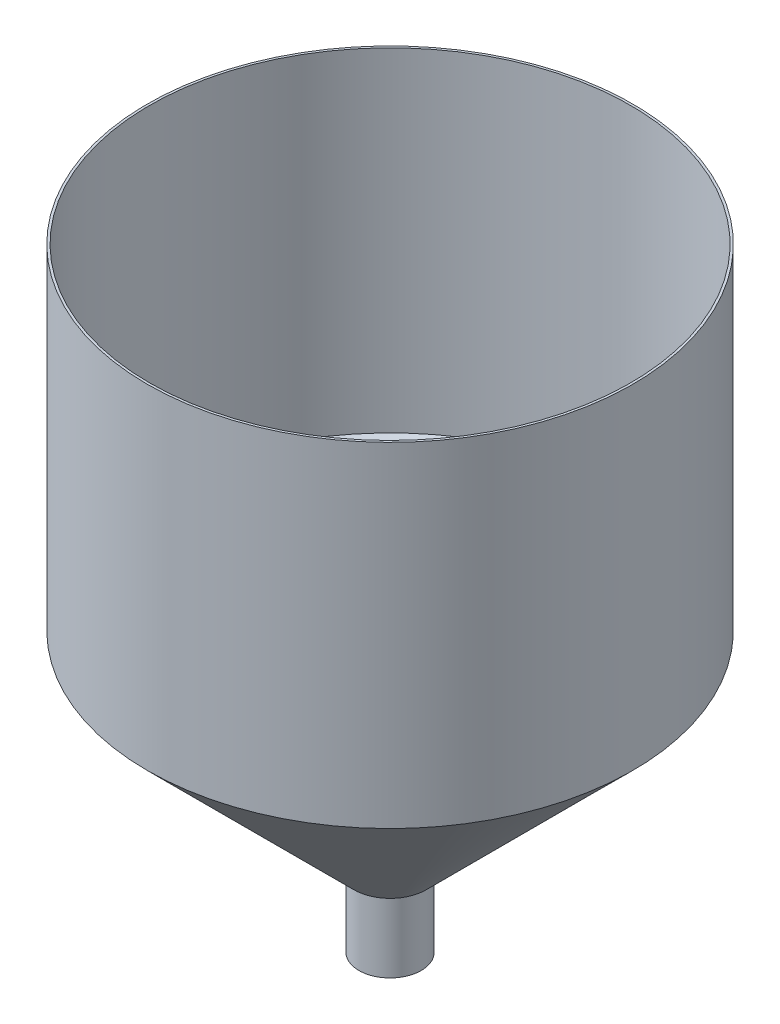
ISO-10303-21;
HEADER;
FILE_DESCRIPTION(('STEP AP214'),'2;1');
FILE_NAME('part.step','',(''),(''),'','','');
FILE_SCHEMA(('AUTOMOTIVE_DESIGN { 1 0 10303 214 1 1 1 1 }'));
ENDSEC;
DATA;
#1=APPLICATION_CONTEXT('core data for automotive mechanical design processes');
#2=APPLICATION_PROTOCOL_DEFINITION('international standard','automotive_design',2000,#1);
#3=PRODUCT_CONTEXT('',#1,'mechanical');
#4=PRODUCT('Part','Part','',(#3));
#5=PRODUCT_RELATED_PRODUCT_CATEGORY('part','',(#4));
#6=PRODUCT_DEFINITION_FORMATION('','',#4);
#7=PRODUCT_DEFINITION_CONTEXT('part definition',#1,'design');
#8=PRODUCT_DEFINITION('design','',#6,#7);
#9=PRODUCT_DEFINITION_SHAPE('','',#8);
#10=(LENGTH_UNIT() NAMED_UNIT(*) SI_UNIT(.MILLI.,.METRE.));
#11=(NAMED_UNIT(*) PLANE_ANGLE_UNIT() SI_UNIT($,.RADIAN.));
#12=(NAMED_UNIT(*) SI_UNIT($,.STERADIAN.) SOLID_ANGLE_UNIT());
#13=UNCERTAINTY_MEASURE_WITH_UNIT(LENGTH_MEASURE(1.E-05),#10,'distance_accuracy_value','');
#14=(GEOMETRIC_REPRESENTATION_CONTEXT(3) GLOBAL_UNCERTAINTY_ASSIGNED_CONTEXT((#13)) GLOBAL_UNIT_ASSIGNED_CONTEXT((#10,
#11,#12)) REPRESENTATION_CONTEXT('',''));
#15=CARTESIAN_POINT('',(0.,0.,0.));
#16=DIRECTION('',(0.,0.,1.));
#17=DIRECTION('',(1.,0.,0.));
#18=AXIS2_PLACEMENT_3D('',#15,#16,#17);
#19=CARTESIAN_POINT('',(0.,-461.3,0.));
#20=DIRECTION('',(0.,1.,0.));
#21=DIRECTION('',(0.,0.,1.));
#22=AXIS2_PLACEMENT_3D('',#19,#20,#21);
#23=CYLINDRICAL_SURFACE('',#22,334.8);
#24=CARTESIAN_POINT('',(0.,-461.3,0.));
#25=DIRECTION('',(0.,-1.,0.));
#26=DIRECTION('',(0.,0.,-1.));
#27=AXIS2_PLACEMENT_3D('',#24,#25,#26);
#28=CIRCLE('',#27,334.8);
#29=CARTESIAN_POINT('',(0.,-461.3,334.8));
#30=VERTEX_POINT('',#29);
#31=EDGE_CURVE('E45',#30,#30,#28,.T.);
#32=ORIENTED_EDGE('',*,*,#31,.F.);
#33=EDGE_LOOP('',(#32));
#34=FACE_BOUND('',#33,.T.);
#35=CARTESIAN_POINT('',(0.,0.,0.));
#36=DIRECTION('',(0.,1.,0.));
#37=DIRECTION('',(0.,0.,1.));
#38=AXIS2_PLACEMENT_3D('',#35,#36,#37);
#39=CIRCLE('',#38,334.8);
#40=CARTESIAN_POINT('',(0.,0.,334.8));
#41=VERTEX_POINT('',#40);
#42=EDGE_CURVE('E37',#41,#41,#39,.T.);
#43=ORIENTED_EDGE('',*,*,#42,.F.);
#44=EDGE_LOOP('',(#43));
#45=FACE_BOUND('',#44,.T.);
#46=ADVANCED_FACE('F34',(#34,#45),#23,.T.);
#47=CARTESIAN_POINT('',(0.,0.,0.));
#48=DIRECTION('',(0.,1.,0.));
#49=DIRECTION('',(0.,0.,1.));
#50=AXIS2_PLACEMENT_3D('',#47,#48,#49);
#51=PLANE('',#50);
#52=CARTESIAN_POINT('',(0.,0.,0.));
#53=DIRECTION('',(0.,1.,0.));
#54=DIRECTION('',(0.,0.,1.));
#55=AXIS2_PLACEMENT_3D('',#52,#53,#54);
#56=CIRCLE('',#55,331.625);
#57=CARTESIAN_POINT('',(0.,0.,331.625));
#58=VERTEX_POINT('',#57);
#59=EDGE_CURVE('E85',#58,#58,#56,.T.);
#60=ORIENTED_EDGE('',*,*,#59,.F.);
#61=EDGE_LOOP('',(#60));
#62=FACE_BOUND('',#61,.T.);
#63=ORIENTED_EDGE('',*,*,#42,.T.);
#64=EDGE_LOOP('',(#63));
#65=FACE_BOUND('',#64,.T.);
#66=ADVANCED_FACE('F73',(#62,#65),#51,.T.);
#67=CARTESIAN_POINT('',(0.,-746.1,0.));
#68=DIRECTION('',(0.,1.,0.));
#69=DIRECTION('',(0.,0.,1.));
#70=AXIS2_PLACEMENT_3D('',#67,#68,#69);
#71=PLANE('',#70);
#72=CARTESIAN_POINT('',(0.,-746.1,0.));
#73=DIRECTION('',(0.,-1.,0.));
#74=DIRECTION('',(0.,0.,-1.));
#75=AXIS2_PLACEMENT_3D('',#72,#73,#74);
#76=CIRCLE('',#75,43.);
#77=CARTESIAN_POINT('',(0.,-746.1,-43.));
#78=VERTEX_POINT('',#77);
#79=EDGE_CURVE('E11',#78,#78,#76,.T.);
#80=ORIENTED_EDGE('',*,*,#79,.F.);
#81=EDGE_LOOP('',(#80));
#82=FACE_BOUND('',#81,.T.);
#83=CARTESIAN_POINT('',(0.,-746.1,0.));
#84=DIRECTION('',(0.,1.,0.));
#85=DIRECTION('',(0.,0.,1.));
#86=AXIS2_PLACEMENT_3D('',#83,#84,#85);
#87=CIRCLE('',#86,50.);
#88=CARTESIAN_POINT('',(0.,-746.1,50.));
#89=VERTEX_POINT('',#88);
#90=EDGE_CURVE('E54',#89,#89,#87,.T.);
#91=ORIENTED_EDGE('',*,*,#90,.F.);
#92=EDGE_LOOP('',(#91));
#93=FACE_BOUND('',#92,.T.);
#94=ADVANCED_FACE('F70',(#82,#93),#71,.F.);
#95=CARTESIAN_POINT('',(0.,-746.1,0.));
#96=DIRECTION('',(0.,1.,0.));
#97=DIRECTION('',(0.,0.,1.));
#98=AXIS2_PLACEMENT_3D('',#95,#96,#97);
#99=CONICAL_SURFACE('',#98,50.,0.785398163397448);
#100=CARTESIAN_POINT('',(0.,-746.1,50.));
#101=CARTESIAN_POINT('',(0.,-743.133333333333,52.9666666666666));
#102=CARTESIAN_POINT('',(0.,-740.166666666667,55.9333333333333));
#103=CARTESIAN_POINT('',(0.,-734.233333333333,61.8666666666666));
#104=CARTESIAN_POINT('',(0.,-731.266666666667,64.8333333333333));
#105=CARTESIAN_POINT('',(0.,-725.333333333333,70.7666666666666));
#106=CARTESIAN_POINT('',(0.,-722.366666666667,73.7333333333333));
#107=CARTESIAN_POINT('',(0.,-716.433333333333,79.6666666666666));
#108=CARTESIAN_POINT('',(0.,-713.466666666667,82.6333333333333));
#109=CARTESIAN_POINT('',(0.,-707.533333333333,88.5666666666666));
#110=CARTESIAN_POINT('',(0.,-704.566666666667,91.5333333333333));
#111=CARTESIAN_POINT('',(0.,-698.633333333333,97.4666666666666));
#112=CARTESIAN_POINT('',(0.,-695.666666666667,100.433333333333));
#113=CARTESIAN_POINT('',(0.,-689.733333333333,106.366666666667));
#114=CARTESIAN_POINT('',(0.,-686.766666666667,109.333333333333));
#115=CARTESIAN_POINT('',(0.,-680.833333333333,115.266666666667));
#116=CARTESIAN_POINT('',(0.,-677.866666666667,118.233333333333));
#117=CARTESIAN_POINT('',(0.,-671.933333333333,124.166666666667));
#118=CARTESIAN_POINT('',(0.,-668.966666666667,127.133333333333));
#119=CARTESIAN_POINT('',(0.,-663.033333333333,133.066666666667));
#120=CARTESIAN_POINT('',(0.,-660.066666666667,136.033333333333));
#121=CARTESIAN_POINT('',(0.,-654.133333333333,141.966666666667));
#122=CARTESIAN_POINT('',(0.,-651.166666666667,144.933333333333));
#123=CARTESIAN_POINT('',(0.,-645.233333333333,150.866666666667));
#124=CARTESIAN_POINT('',(0.,-642.266666666667,153.833333333333));
#125=CARTESIAN_POINT('',(0.,-636.333333333333,159.766666666667));
#126=CARTESIAN_POINT('',(0.,-633.366666666667,162.733333333333));
#127=CARTESIAN_POINT('',(0.,-627.433333333333,168.666666666667));
#128=CARTESIAN_POINT('',(0.,-624.466666666667,171.633333333333));
#129=CARTESIAN_POINT('',(0.,-618.533333333333,177.566666666667));
#130=CARTESIAN_POINT('',(0.,-615.566666666667,180.533333333333));
#131=CARTESIAN_POINT('',(0.,-609.633333333333,186.466666666667));
#132=CARTESIAN_POINT('',(0.,-606.666666666667,189.433333333333));
#133=CARTESIAN_POINT('',(0.,-600.733333333333,195.366666666667));
#134=CARTESIAN_POINT('',(0.,-597.766666666667,198.333333333333));
#135=CARTESIAN_POINT('',(0.,-591.833333333333,204.266666666667));
#136=CARTESIAN_POINT('',(0.,-588.866666666667,207.233333333333));
#137=CARTESIAN_POINT('',(0.,-582.933333333333,213.166666666667));
#138=CARTESIAN_POINT('',(0.,-579.966666666667,216.133333333333));
#139=CARTESIAN_POINT('',(0.,-574.033333333333,222.066666666667));
#140=CARTESIAN_POINT('',(0.,-571.066666666667,225.033333333333));
#141=CARTESIAN_POINT('',(0.,-565.133333333333,230.966666666667));
#142=CARTESIAN_POINT('',(0.,-562.166666666667,233.933333333333));
#143=CARTESIAN_POINT('',(0.,-556.233333333333,239.866666666667));
#144=CARTESIAN_POINT('',(0.,-553.266666666667,242.833333333333));
#145=CARTESIAN_POINT('',(0.,-547.333333333333,248.766666666667));
#146=CARTESIAN_POINT('',(0.,-544.366666666667,251.733333333333));
#147=CARTESIAN_POINT('',(0.,-538.433333333333,257.666666666667));
#148=CARTESIAN_POINT('',(0.,-535.466666666667,260.633333333333));
#149=CARTESIAN_POINT('',(0.,-529.533333333333,266.566666666667));
#150=CARTESIAN_POINT('',(0.,-526.566666666667,269.533333333333));
#151=CARTESIAN_POINT('',(0.,-520.633333333333,275.466666666667));
#152=CARTESIAN_POINT('',(0.,-517.666666666667,278.433333333333));
#153=CARTESIAN_POINT('',(0.,-511.733333333333,284.366666666667));
#154=CARTESIAN_POINT('',(0.,-508.766666666667,287.333333333333));
#155=CARTESIAN_POINT('',(0.,-502.833333333333,293.266666666667));
#156=CARTESIAN_POINT('',(0.,-499.866666666667,296.233333333333));
#157=CARTESIAN_POINT('',(0.,-493.933333333333,302.166666666667));
#158=CARTESIAN_POINT('',(0.,-490.966666666667,305.133333333333));
#159=CARTESIAN_POINT('',(0.,-485.033333333333,311.066666666667));
#160=CARTESIAN_POINT('',(0.,-482.066666666667,314.033333333333));
#161=CARTESIAN_POINT('',(0.,-476.133333333333,319.966666666667));
#162=CARTESIAN_POINT('',(0.,-473.166666666667,322.933333333333));
#163=CARTESIAN_POINT('',(0.,-467.233333333333,328.866666666667));
#164=CARTESIAN_POINT('',(0.,-464.266666666667,331.833333333333));
#165=CARTESIAN_POINT('',(0.,-461.3,334.8));
#166=B_SPLINE_CURVE_WITH_KNOTS('',3,(#100,#101,#102,#103,#104,#105,#106,#107,#108,#109,#110,
#111,#112,#113,#114,#115,#116,#117,#118,#119,#120,#121,#122,#123,#124,#125,#126,#127,#128,#129,
#130,#131,#132,#133,#134,#135,#136,#137,#138,#139,#140,#141,#142,#143,#144,#145,#146,#147,#148,
#149,#150,#151,#152,#153,#154,#155,#156,#157,#158,#159,#160,#161,#162,#163,#164,#165),
.UNSPECIFIED.,.F.,.F.,(4,2,2,2,2,2,2,2,2,2,2,2,2,2,2,2,2,2,2,2,2,2,2,2,2,2,2,2,2,2,2,2,4),(0.,
12.5865007051205,25.173001410241,37.7595021153616,50.3460028204822,62.9325035256027,
75.5190042307233,88.1055049358438,100.692005640964,113.278506346085,125.865007051205,
138.451507756326,151.038008461447,163.624509166567,176.211009871688,188.797510576808,
201.384011281929,213.970511987049,226.55701269217,239.14351339729,251.730014102411,
264.316514807531,276.903015512652,289.489516217773,302.076016922893,314.662517628014,
327.249018333134,339.835519038255,352.422019743375,365.008520448496,377.595021153616,
390.181521858737,402.768022563858),.UNSPECIFIED.);
#167=EDGE_CURVE('BSEAM60',#89,#30,#166,.T.);
#168=ORIENTED_EDGE('',*,*,#90,.T.);
#169=ORIENTED_EDGE('',*,*,#31,.T.);
#170=ORIENTED_EDGE('',*,*,#167,.T.);
#171=ORIENTED_EDGE('',*,*,#167,.F.);
#172=EDGE_LOOP('',(#168,#170,#169,#171));
#173=FACE_BOUND('',#172,.T.);
#174=ADVANCED_FACE('F60',(#173),#99,.T.);
#175=CARTESIAN_POINT('',(0.,-846.1,0.));
#176=DIRECTION('',(0.,1.,0.));
#177=DIRECTION('',(0.,0.,1.));
#178=AXIS2_PLACEMENT_3D('',#175,#176,#177);
#179=CYLINDRICAL_SURFACE('',#178,43.);
#180=CARTESIAN_POINT('',(0.,-846.1,0.));
#181=DIRECTION('',(0.,-1.,0.));
#182=DIRECTION('',(0.,0.,-1.));
#183=AXIS2_PLACEMENT_3D('',#180,#181,#182);
#184=CIRCLE('',#183,43.);
#185=CARTESIAN_POINT('',(0.,-846.1,-43.));
#186=VERTEX_POINT('',#185);
#187=EDGE_CURVE('E48',#186,#186,#184,.T.);
#188=ORIENTED_EDGE('',*,*,#187,.F.);
#189=EDGE_LOOP('',(#188));
#190=FACE_BOUND('',#189,.T.);
#191=ORIENTED_EDGE('',*,*,#79,.T.);
#192=EDGE_LOOP('',(#191));
#193=FACE_BOUND('',#192,.T.);
#194=ADVANCED_FACE('F69',(#190,#193),#179,.T.);
#195=CARTESIAN_POINT('',(0.,-846.1,0.));
#196=DIRECTION('',(0.,-1.,0.));
#197=DIRECTION('',(0.,0.,-1.));
#198=AXIS2_PLACEMENT_3D('',#195,#196,#197);
#199=PLANE('',#198);
#200=CARTESIAN_POINT('',(0.,-846.1,0.));
#201=DIRECTION('',(0.,-1.,0.));
#202=DIRECTION('',(0.,0.,-1.));
#203=AXIS2_PLACEMENT_3D('',#200,#201,#202);
#204=CIRCLE('',#203,39.825);
#205=CARTESIAN_POINT('',(0.,-846.1,-39.825));
#206=VERTEX_POINT('',#205);
#207=EDGE_CURVE('E98',#206,#206,#204,.T.);
#208=ORIENTED_EDGE('',*,*,#207,.F.);
#209=EDGE_LOOP('',(#208));
#210=FACE_BOUND('',#209,.T.);
#211=ORIENTED_EDGE('',*,*,#187,.T.);
#212=EDGE_LOOP('',(#211));
#213=FACE_BOUND('',#212,.T.);
#214=ADVANCED_FACE('F116',(#210,#213),#199,.T.);
#215=CARTESIAN_POINT('',(0.,-461.3,0.));
#216=DIRECTION('',(0.,1.,0.));
#217=DIRECTION('',(0.,0.,1.));
#218=AXIS2_PLACEMENT_3D('',#215,#216,#217);
#219=CYLINDRICAL_SURFACE('',#218,331.625);
#220=CARTESIAN_POINT('',(0.,-459.984871939465,0.));
#221=DIRECTION('',(0.,1.,0.));
#222=DIRECTION('',(0.,0.,1.));
#223=AXIS2_PLACEMENT_3D('',#220,#221,#222);
#224=CIRCLE('',#223,331.625);
#225=CARTESIAN_POINT('',(0.,-459.984871939465,331.625));
#226=VERTEX_POINT('',#225);
#227=EDGE_CURVE('E90',#226,#226,#224,.F.);
#228=ORIENTED_EDGE('',*,*,#227,.T.);
#229=EDGE_LOOP('',(#228));
#230=FACE_BOUND('',#229,.T.);
#231=ORIENTED_EDGE('',*,*,#59,.T.);
#232=EDGE_LOOP('',(#231));
#233=FACE_BOUND('',#232,.T.);
#234=ADVANCED_FACE('F114',(#230,#233),#219,.F.);
#235=CARTESIAN_POINT('',(0.,-742.925,0.));
#236=DIRECTION('',(0.,1.,0.));
#237=DIRECTION('',(0.,0.,1.));
#238=AXIS2_PLACEMENT_3D('',#235,#236,#237);
#239=PLANE('',#238);
#240=CARTESIAN_POINT('',(0.,-742.925,0.));
#241=DIRECTION('',(0.,1.,0.));
#242=DIRECTION('',(0.,0.,1.));
#243=AXIS2_PLACEMENT_3D('',#240,#241,#242);
#244=CIRCLE('',#243,39.825);
#245=CARTESIAN_POINT('',(0.,-742.925,39.825));
#246=VERTEX_POINT('',#245);
#247=EDGE_CURVE('E89',#246,#246,#244,.F.);
#248=ORIENTED_EDGE('',*,*,#247,.T.);
#249=EDGE_LOOP('',(#248));
#250=FACE_BOUND('',#249,.T.);
#251=CARTESIAN_POINT('',(0.,-742.925,0.));
#252=DIRECTION('',(0.,1.,0.));
#253=DIRECTION('',(0.,0.,1.));
#254=AXIS2_PLACEMENT_3D('',#251,#252,#253);
#255=CIRCLE('',#254,48.6848719394655);
#256=CARTESIAN_POINT('',(0.,-742.925,48.6848719394654));
#257=VERTEX_POINT('',#256);
#258=EDGE_CURVE('E95',#257,#257,#255,.T.);
#259=ORIENTED_EDGE('',*,*,#258,.T.);
#260=EDGE_LOOP('',(#259));
#261=FACE_BOUND('',#260,.T.);
#262=ADVANCED_FACE('F105',(#250,#261),#239,.T.);
#263=CARTESIAN_POINT('',(0.,-743.854935969733,0.));
#264=DIRECTION('',(0.,1.,0.));
#265=DIRECTION('',(0.,0.,1.));
#266=AXIS2_PLACEMENT_3D('',#263,#264,#265);
#267=CONICAL_SURFACE('',#266,47.7549359697327,0.785398163397448);
#268=CARTESIAN_POINT('',(0.,-742.925,48.6848719394654));
#269=CARTESIAN_POINT('',(0.,-739.97770699937,51.632164940096));
#270=CARTESIAN_POINT('',(0.,-737.030413998739,54.5794579407266));
#271=CARTESIAN_POINT('',(0.,-731.135827997478,60.4740439419877));
#272=CARTESIAN_POINT('',(0.,-728.188534996847,63.4213369426183));
#273=CARTESIAN_POINT('',(0.,-722.293948995586,69.3159229438794));
#274=CARTESIAN_POINT('',(0.,-719.346655994956,72.26321594451));
#275=CARTESIAN_POINT('',(0.,-713.452069993694,78.1578019457711));
#276=CARTESIAN_POINT('',(0.,-710.504776993064,81.1050949464017));
#277=CARTESIAN_POINT('',(0.,-704.610190991803,86.9996809476628));
#278=CARTESIAN_POINT('',(0.,-701.662897991172,89.9469739482934));
#279=CARTESIAN_POINT('',(0.,-695.768311989911,95.8415599495545));
#280=CARTESIAN_POINT('',(0.,-692.82101898928,98.7888529501851));
#281=CARTESIAN_POINT('',(0.,-686.926432988019,104.683438951446));
#282=CARTESIAN_POINT('',(0.,-683.979139987389,107.630731952077));
#283=CARTESIAN_POINT('',(0.,-678.084553986128,113.525317953338));
#284=CARTESIAN_POINT('',(0.,-675.137260985497,116.472610953969));
#285=CARTESIAN_POINT('',(0.,-669.242674984236,122.36719695523));
#286=CARTESIAN_POINT('',(0.,-666.295381983605,125.31448995586));
#287=CARTESIAN_POINT('',(0.,-660.400795982344,131.209075957121));
#288=CARTESIAN_POINT('',(0.,-657.453502981714,134.156368957752));
#289=CARTESIAN_POINT('',(0.,-651.558916980452,140.050954959013));
#290=CARTESIAN_POINT('',(0.,-648.611623979822,142.998247959644));
#291=CARTESIAN_POINT('',(0.,-642.717037978561,148.892833960905));
#292=CARTESIAN_POINT('',(0.,-639.76974497793,151.840126961535));
#293=CARTESIAN_POINT('',(0.,-633.875158976669,157.734712962796));
#294=CARTESIAN_POINT('',(0.,-630.927865976038,160.682005963427));
#295=CARTESIAN_POINT('',(0.,-625.033279974777,166.576591964688));
#296=CARTESIAN_POINT('',(0.,-622.085986974147,169.523884965319));
#297=CARTESIAN_POINT('',(0.,-616.191400972886,175.41847096658));
#298=CARTESIAN_POINT('',(0.,-613.244107972255,178.36576396721));
#299=CARTESIAN_POINT('',(0.,-607.349521970994,184.260349968472));
#300=CARTESIAN_POINT('',(0.,-604.402228970363,187.207642969102));
#301=CARTESIAN_POINT('',(0.,-598.507642969102,193.102228970363));
#302=CARTESIAN_POINT('',(0.,-595.560349968472,196.049521970994));
#303=CARTESIAN_POINT('',(0.,-589.665763967211,201.944107972255));
#304=CARTESIAN_POINT('',(0.,-586.71847096658,204.891400972886));
#305=CARTESIAN_POINT('',(0.,-580.823884965319,210.785986974147));
#306=CARTESIAN_POINT('',(0.,-577.876591964688,213.733279974777));
#307=CARTESIAN_POINT('',(0.,-571.982005963427,219.627865976038));
#308=CARTESIAN_POINT('',(0.,-569.034712962797,222.575158976669));
#309=CARTESIAN_POINT('',(0.,-563.140126961535,228.46974497793));
#310=CARTESIAN_POINT('',(0.,-560.192833960905,231.417037978561));
#311=CARTESIAN_POINT('',(0.,-554.298247959644,237.311623979822));
#312=CARTESIAN_POINT('',(0.,-551.350954959013,240.258916980452));
#313=CARTESIAN_POINT('',(0.,-545.456368957752,246.153502981714));
#314=CARTESIAN_POINT('',(0.,-542.509075957121,249.100795982344));
#315=CARTESIAN_POINT('',(0.,-536.61448995586,254.995381983605));
#316=CARTESIAN_POINT('',(0.,-533.66719695523,257.942674984236));
#317=CARTESIAN_POINT('',(0.,-527.772610953969,263.837260985497));
#318=CARTESIAN_POINT('',(0.,-524.825317953338,266.784553986127));
#319=CARTESIAN_POINT('',(0.,-518.930731952077,272.679139987389));
#320=CARTESIAN_POINT('',(0.,-515.983438951446,275.626432988019));
#321=CARTESIAN_POINT('',(0.,-510.088852950185,281.52101898928));
#322=CARTESIAN_POINT('',(0.,-507.141559949555,284.468311989911));
#323=CARTESIAN_POINT('',(0.,-501.246973948293,290.362897991172));
#324=CARTESIAN_POINT('',(0.,-498.299680947663,293.310190991803));
#325=CARTESIAN_POINT('',(0.,-492.405094946402,299.204776993064));
#326=CARTESIAN_POINT('',(0.,-489.457801945771,302.152069993694));
#327=CARTESIAN_POINT('',(0.,-483.56321594451,308.046655994955));
#328=CARTESIAN_POINT('',(0.,-480.615922943879,310.993948995586));
#329=CARTESIAN_POINT('',(0.,-474.721336942618,316.888534996847));
#330=CARTESIAN_POINT('',(0.,-471.774043941988,319.835827997478));
#331=CARTESIAN_POINT('',(0.,-465.879457940727,325.730413998739));
#332=CARTESIAN_POINT('',(0.,-462.932164940096,328.677706999369));
#333=CARTESIAN_POINT('',(0.,-459.984871939465,331.625));
#334=B_SPLINE_CURVE_WITH_KNOTS('',3,(#268,#269,#270,#271,#272,#273,#274,#275,#276,#277,#278,
#279,#280,#281,#282,#283,#284,#285,#286,#287,#288,#289,#290,#291,#292,#293,#294,#295,#296,#297,
#298,#299,#300,#301,#302,#303,#304,#305,#306,#307,#308,#309,#310,#311,#312,#313,#314,#315,#316,
#317,#318,#319,#320,#321,#322,#323,#324,#325,#326,#327,#328,#329,#330,#331,#332,#333),
.UNSPECIFIED.,.F.,.F.,(4,2,2,2,2,2,2,2,2,2,2,2,2,2,2,2,2,2,2,2,2,2,2,2,2,2,2,2,2,2,2,2,4),(0.,
12.5043052013371,25.0086104026743,37.5129156040114,50.0172208053485,62.5215260066857,
75.0258312080228,87.5301364093599,100.034441610697,112.538746812034,125.043052013371,
137.547357214708,150.051662416046,162.555967617383,175.06027281872,187.564578020057,
200.068883221394,212.573188422731,225.077493624068,237.581798825406,250.086104026743,
262.59040922808,275.094714429417,287.599019630754,300.103324832091,312.607630033429,
325.111935234766,337.616240436103,350.12054563744,362.624850838777,375.129156040114,
387.633461241451,400.137766442789),.UNSPECIFIED.);
#335=EDGE_CURVE('BSEAM107',#257,#226,#334,.T.);
#336=ORIENTED_EDGE('',*,*,#258,.F.);
#337=ORIENTED_EDGE('',*,*,#227,.F.);
#338=ORIENTED_EDGE('',*,*,#335,.T.);
#339=ORIENTED_EDGE('',*,*,#335,.F.);
#340=EDGE_LOOP('',(#336,#338,#337,#339));
#341=FACE_BOUND('',#340,.T.);
#342=ADVANCED_FACE('F107',(#341),#267,.F.);
#343=CARTESIAN_POINT('',(0.,-846.1,0.));
#344=DIRECTION('',(0.,1.,0.));
#345=DIRECTION('',(0.,0.,1.));
#346=AXIS2_PLACEMENT_3D('',#343,#344,#345);
#347=CYLINDRICAL_SURFACE('',#346,39.825);
#348=ORIENTED_EDGE('',*,*,#207,.T.);
#349=EDGE_LOOP('',(#348));
#350=FACE_BOUND('',#349,.T.);
#351=ORIENTED_EDGE('',*,*,#247,.F.);
#352=EDGE_LOOP('',(#351));
#353=FACE_BOUND('',#352,.T.);
#354=ADVANCED_FACE('F110',(#350,#353),#347,.F.);
#355=CLOSED_SHELL('',(#46,#66,#94,#174,#194,#214,#234,#262,#342,#354));
#356=MANIFOLD_SOLID_BREP('B2',#355);
#357=ADVANCED_BREP_SHAPE_REPRESENTATION('',(#18,#356),#14);
#358=SHAPE_DEFINITION_REPRESENTATION(#9,#357);
ENDSEC;
END-ISO-10303-21;
